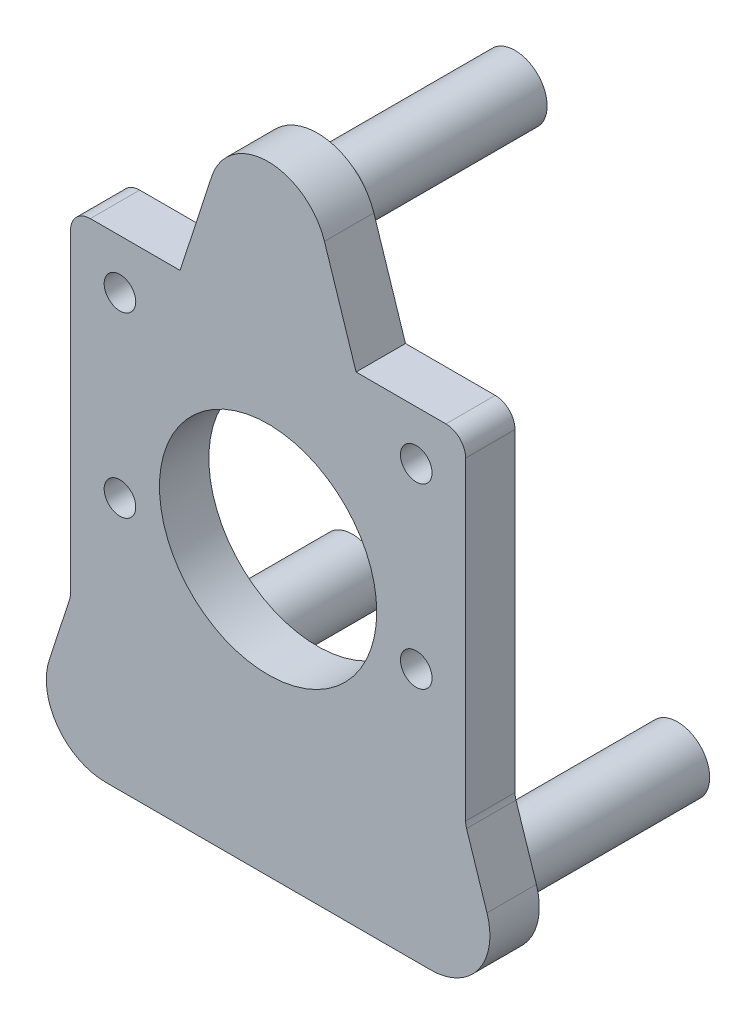
ISO-10303-21;
HEADER;
FILE_DESCRIPTION(('STEP AP214'),'2;1');
FILE_NAME('part.step','',(''),(''),'','','');
FILE_SCHEMA(('AUTOMOTIVE_DESIGN { 1 0 10303 214 1 1 1 1 }'));
ENDSEC;
DATA;
#1=APPLICATION_CONTEXT('core data for automotive mechanical design processes');
#2=APPLICATION_PROTOCOL_DEFINITION('international standard','automotive_design',2000,#1);
#3=PRODUCT_CONTEXT('',#1,'mechanical');
#4=PRODUCT('Part','Part','',(#3));
#5=PRODUCT_RELATED_PRODUCT_CATEGORY('part','',(#4));
#6=PRODUCT_DEFINITION_FORMATION('','',#4);
#7=PRODUCT_DEFINITION_CONTEXT('part definition',#1,'design');
#8=PRODUCT_DEFINITION('design','',#6,#7);
#9=PRODUCT_DEFINITION_SHAPE('','',#8);
#10=(LENGTH_UNIT() NAMED_UNIT(*) SI_UNIT(.MILLI.,.METRE.));
#11=(NAMED_UNIT(*) PLANE_ANGLE_UNIT() SI_UNIT($,.RADIAN.));
#12=(NAMED_UNIT(*) SI_UNIT($,.STERADIAN.) SOLID_ANGLE_UNIT());
#13=UNCERTAINTY_MEASURE_WITH_UNIT(LENGTH_MEASURE(1.E-05),#10,'distance_accuracy_value','');
#14=(GEOMETRIC_REPRESENTATION_CONTEXT(3) GLOBAL_UNCERTAINTY_ASSIGNED_CONTEXT((#13)) GLOBAL_UNIT_ASSIGNED_CONTEXT((#10,
#11,#12)) REPRESENTATION_CONTEXT('',''));
#15=CARTESIAN_POINT('',(0.,0.,0.));
#16=DIRECTION('',(0.,0.,1.));
#17=DIRECTION('',(1.,0.,0.));
#18=AXIS2_PLACEMENT_3D('',#15,#16,#17);
#19=CARTESIAN_POINT('',(5.70633909777092,29.8541019662497,5.));
#20=DIRECTION('',(-0.951056516295154,-0.309016994374947,0.));
#21=DIRECTION('',(0.309016994374947,-0.951056516295154,0.));
#22=AXIS2_PLACEMENT_3D('',#19,#20,#21);
#23=PLANE('',#22);
#24=DIRECTION('',(-0.309016994374947,0.951056516295154,0.));
#25=VECTOR('',#24,1.);
#26=CARTESIAN_POINT('',(5.70633909777092,29.8541019662497,5.));
#27=LINE('',#26,#25);
#28=CARTESIAN_POINT('',(8.90813091529285,20.,5.));
#29=VERTEX_POINT('',#28);
#30=CARTESIAN_POINT('',(5.70633909777093,29.8541019662497,5.));
#31=VERTEX_POINT('',#30);
#32=EDGE_CURVE('E168',#29,#31,#27,.T.);
#33=ORIENTED_EDGE('',*,*,#32,.F.);
#34=DIRECTION('',(0.,0.,1.));
#35=VECTOR('',#34,1.);
#36=CARTESIAN_POINT('',(8.90813091529285,20.,0.));
#37=LINE('',#36,#35);
#38=CARTESIAN_POINT('',(8.90813091529285,20.,0.));
#39=VERTEX_POINT('',#38);
#40=EDGE_CURVE('E156',#39,#29,#37,.T.);
#41=ORIENTED_EDGE('',*,*,#40,.F.);
#42=DIRECTION('',(-0.309016994374947,0.951056516295154,0.));
#43=VECTOR('',#42,1.);
#44=CARTESIAN_POINT('',(5.70633909777092,29.8541019662497,0.));
#45=LINE('',#44,#43);
#46=CARTESIAN_POINT('',(5.70633909777093,29.8541019662497,0.));
#47=VERTEX_POINT('',#46);
#48=EDGE_CURVE('E166',#39,#47,#45,.T.);
#49=ORIENTED_EDGE('',*,*,#48,.T.);
#50=DIRECTION('',(0.,0.,-1.));
#51=VECTOR('',#50,1.);
#52=CARTESIAN_POINT('',(5.70633909777093,29.8541019662497,5.));
#53=LINE('',#52,#51);
#54=EDGE_CURVE('E220',#31,#47,#53,.T.);
#55=ORIENTED_EDGE('',*,*,#54,.F.);
#56=EDGE_LOOP('',(#33,#41,#49,#55));
#57=FACE_BOUND('',#56,.T.);
#58=ADVANCED_FACE('F39',(#57),#23,.F.);
#59=CARTESIAN_POINT('',(-5.70633909777092,29.8541019662497,5.));
#60=DIRECTION('',(0.951056516295154,-0.309016994374947,0.));
#61=DIRECTION('',(0.309016994374947,0.951056516295154,0.));
#62=AXIS2_PLACEMENT_3D('',#59,#60,#61);
#63=PLANE('',#62);
#64=DIRECTION('',(-0.309016994374947,-0.951056516295154,0.));
#65=VECTOR('',#64,1.);
#66=CARTESIAN_POINT('',(-5.70633909777092,29.8541019662497,5.));
#67=LINE('',#66,#65);
#68=CARTESIAN_POINT('',(-20.0978869674098,-14.4385279866074,5.));
#69=VERTEX_POINT('',#68);
#70=CARTESIAN_POINT('',(-22.1643261619602,-20.7983738762488,5.));
#71=VERTEX_POINT('',#70);
#72=EDGE_CURVE('E301',#69,#71,#67,.T.);
#73=ORIENTED_EDGE('',*,*,#72,.F.);
#74=DIRECTION('',(0.,0.,1.));
#75=VECTOR('',#74,1.);
#76=CARTESIAN_POINT('',(-20.0978869674098,-14.4385279866074,5.));
#77=LINE('',#76,#75);
#78=CARTESIAN_POINT('',(-20.0978869674098,-14.4385279866074,0.));
#79=VERTEX_POINT('',#78);
#80=EDGE_CURVE('E269',#69,#79,#77,.F.);
#81=ORIENTED_EDGE('',*,*,#80,.T.);
#82=DIRECTION('',(-0.309016994374947,-0.951056516295154,0.));
#83=VECTOR('',#82,1.);
#84=CARTESIAN_POINT('',(-5.70633909777092,29.8541019662497,0.));
#85=LINE('',#84,#83);
#86=CARTESIAN_POINT('',(-22.1643261619602,-20.7983738762488,0.));
#87=VERTEX_POINT('',#86);
#88=EDGE_CURVE('E191',#79,#87,#85,.T.);
#89=ORIENTED_EDGE('',*,*,#88,.T.);
#90=DIRECTION('',(0.,0.,-1.));
#91=VECTOR('',#90,1.);
#92=CARTESIAN_POINT('',(-22.1643261619602,-20.7983738762488,5.));
#93=LINE('',#92,#91);
#94=EDGE_CURVE('E212',#71,#87,#93,.T.);
#95=ORIENTED_EDGE('',*,*,#94,.F.);
#96=EDGE_LOOP('',(#73,#81,#89,#95));
#97=FACE_BOUND('',#96,.T.);
#98=ADVANCED_FACE('F308',(#97),#63,.F.);
#99=CARTESIAN_POINT('',(16.4579870641893,-22.6524758424985,5.));
#100=DIRECTION('',(0.,0.,1.));
#101=DIRECTION('',(1.,0.,0.));
#102=AXIS2_PLACEMENT_3D('',#99,#100,#101);
#103=PLANE('',#102);
#104=CARTESIAN_POINT('',(-14.9999999999998,-3.,5.));
#105=DIRECTION('',(0.,0.,1.));
#106=DIRECTION('',(1.,0.,0.));
#107=AXIS2_PLACEMENT_3D('',#104,#105,#106);
#108=CIRCLE('',#107,1.6);
#109=CARTESIAN_POINT('',(-13.3999999999998,-3.,5.));
#110=VERTEX_POINT('',#109);
#111=EDGE_CURVE('E415',#110,#110,#108,.T.);
#112=ORIENTED_EDGE('',*,*,#111,.F.);
#113=EDGE_LOOP('',(#112));
#114=FACE_BOUND('',#113,.T.);
#115=CARTESIAN_POINT('',(15.0000000000002,-3.,5.));
#116=DIRECTION('',(0.,0.,1.));
#117=DIRECTION('',(1.,0.,0.));
#118=AXIS2_PLACEMENT_3D('',#115,#116,#117);
#119=CIRCLE('',#118,1.6);
#120=CARTESIAN_POINT('',(16.6000000000002,-3.,5.));
#121=VERTEX_POINT('',#120);
#122=EDGE_CURVE('E423',#121,#121,#119,.T.);
#123=ORIENTED_EDGE('',*,*,#122,.F.);
#124=EDGE_LOOP('',(#123));
#125=FACE_BOUND('',#124,.T.);
#126=CARTESIAN_POINT('',(15.,15.,5.));
#127=DIRECTION('',(0.,0.,1.));
#128=DIRECTION('',(1.,0.,0.));
#129=AXIS2_PLACEMENT_3D('',#126,#127,#128);
#130=CIRCLE('',#129,1.6);
#131=CARTESIAN_POINT('',(16.6,15.,5.));
#132=VERTEX_POINT('',#131);
#133=EDGE_CURVE('E431',#132,#132,#130,.T.);
#134=ORIENTED_EDGE('',*,*,#133,.F.);
#135=EDGE_LOOP('',(#134));
#136=FACE_BOUND('',#135,.T.);
#137=CARTESIAN_POINT('',(-15.,15.,5.));
#138=DIRECTION('',(0.,0.,1.));
#139=DIRECTION('',(1.,0.,0.));
#140=AXIS2_PLACEMENT_3D('',#137,#138,#139);
#141=CIRCLE('',#140,1.6);
#142=CARTESIAN_POINT('',(-13.4,15.,5.));
#143=VERTEX_POINT('',#142);
#144=EDGE_CURVE('E407',#143,#143,#141,.T.);
#145=ORIENTED_EDGE('',*,*,#144,.F.);
#146=EDGE_LOOP('',(#145));
#147=FACE_BOUND('',#146,.T.);
#148=DIRECTION('',(0.,1.,0.));
#149=VECTOR('',#148,1.);
#150=CARTESIAN_POINT('',(20.,20.,5.));
#151=LINE('',#150,#149);
#152=CARTESIAN_POINT('',(20.,-13.8204939978573,5.));
#153=VERTEX_POINT('',#152);
#154=CARTESIAN_POINT('',(20.,18.,5.));
#155=VERTEX_POINT('',#154);
#156=EDGE_CURVE('E162',#153,#155,#151,.T.);
#157=ORIENTED_EDGE('',*,*,#156,.T.);
#158=CARTESIAN_POINT('',(18.,18.,5.));
#159=DIRECTION('',(0.,0.,1.));
#160=DIRECTION('',(1.,0.,0.));
#161=AXIS2_PLACEMENT_3D('',#158,#159,#160);
#162=CIRCLE('',#161,2.);
#163=CARTESIAN_POINT('',(18.,20.,5.));
#164=VERTEX_POINT('',#163);
#165=EDGE_CURVE('E275',#155,#164,#162,.T.);
#166=ORIENTED_EDGE('',*,*,#165,.T.);
#167=DIRECTION('',(-1.,0.,0.));
#168=VECTOR('',#167,1.);
#169=CARTESIAN_POINT('',(8.90813091529285,20.,5.));
#170=LINE('',#169,#168);
#171=EDGE_CURVE('E396',#164,#29,#170,.T.);
#172=ORIENTED_EDGE('',*,*,#171,.T.);
#173=ORIENTED_EDGE('',*,*,#32,.T.);
#174=CARTESIAN_POINT('',(0.,28.,5.));
#175=DIRECTION('',(0.,0.,1.));
#176=DIRECTION('',(1.,0.,0.));
#177=AXIS2_PLACEMENT_3D('',#174,#175,#176);
#178=CIRCLE('',#177,6.);
#179=CARTESIAN_POINT('',(-5.70633909777092,29.8541019662497,5.));
#180=VERTEX_POINT('',#179);
#181=EDGE_CURVE('E313',#31,#180,#178,.T.);
#182=ORIENTED_EDGE('',*,*,#181,.T.);
#183=CARTESIAN_POINT('',(-8.90813091529286,20.,5.));
#184=VERTEX_POINT('',#183);
#185=EDGE_CURVE('E312',#180,#184,#67,.T.);
#186=ORIENTED_EDGE('',*,*,#185,.T.);
#187=DIRECTION('',(-1.,0.,0.));
#188=VECTOR('',#187,1.);
#189=CARTESIAN_POINT('',(-20.,20.,5.));
#190=LINE('',#189,#188);
#191=CARTESIAN_POINT('',(-18.,20.,5.));
#192=VERTEX_POINT('',#191);
#193=EDGE_CURVE('E325',#184,#192,#190,.T.);
#194=ORIENTED_EDGE('',*,*,#193,.T.);
#195=CARTESIAN_POINT('',(-18.,18.,5.));
#196=DIRECTION('',(0.,0.,1.));
#197=DIRECTION('',(1.,0.,0.));
#198=AXIS2_PLACEMENT_3D('',#195,#196,#197);
#199=CIRCLE('',#198,2.);
#200=CARTESIAN_POINT('',(-20.,18.,5.));
#201=VERTEX_POINT('',#200);
#202=EDGE_CURVE('E272',#192,#201,#199,.T.);
#203=ORIENTED_EDGE('',*,*,#202,.T.);
#204=DIRECTION('',(0.,-1.,0.));
#205=VECTOR('',#204,1.);
#206=CARTESIAN_POINT('',(-20.,20.,5.));
#207=LINE('',#206,#205);
#208=CARTESIAN_POINT('',(-20.0000000000001,-13.8204939978575,5.));
#209=VERTEX_POINT('',#208);
#210=EDGE_CURVE('E170',#201,#209,#207,.T.);
#211=ORIENTED_EDGE('',*,*,#210,.T.);
#212=CARTESIAN_POINT('',(-22.0000000000001,-13.8204939978575,5.));
#213=DIRECTION('',(0.,0.,1.));
#214=DIRECTION('',(1.,0.,0.));
#215=AXIS2_PLACEMENT_3D('',#212,#213,#214);
#216=CIRCLE('',#215,2.);
#217=EDGE_CURVE('E48',#209,#69,#216,.F.);
#218=ORIENTED_EDGE('',*,*,#217,.T.);
#219=ORIENTED_EDGE('',*,*,#72,.T.);
#220=CARTESIAN_POINT('',(-16.4579870641892,-22.6524758424985,5.));
#221=DIRECTION('',(0.,0.,1.));
#222=DIRECTION('',(1.,0.,0.));
#223=AXIS2_PLACEMENT_3D('',#220,#221,#222);
#224=CIRCLE('',#223,6.);
#225=CARTESIAN_POINT('',(-16.4579870641892,-28.6524758424985,5.));
#226=VERTEX_POINT('',#225);
#227=EDGE_CURVE('E370',#71,#226,#224,.T.);
#228=ORIENTED_EDGE('',*,*,#227,.T.);
#229=DIRECTION('',(1.,0.,0.));
#230=VECTOR('',#229,1.);
#231=CARTESIAN_POINT('',(-16.4579870641892,-28.6524758424985,5.));
#232=LINE('',#231,#230);
#233=CARTESIAN_POINT('',(16.4579870641893,-28.6524758424985,5.));
#234=VERTEX_POINT('',#233);
#235=EDGE_CURVE('E208',#226,#234,#232,.T.);
#236=ORIENTED_EDGE('',*,*,#235,.T.);
#237=CARTESIAN_POINT('',(16.4579870641893,-22.6524758424985,5.));
#238=DIRECTION('',(0.,0.,1.));
#239=DIRECTION('',(1.,0.,0.));
#240=AXIS2_PLACEMENT_3D('',#237,#238,#239);
#241=CIRCLE('',#240,6.);
#242=CARTESIAN_POINT('',(22.1643261619602,-20.7983738762488,5.));
#243=VERTEX_POINT('',#242);
#244=EDGE_CURVE('E202',#234,#243,#241,.T.);
#245=ORIENTED_EDGE('',*,*,#244,.T.);
#246=CARTESIAN_POINT('',(20.0978869674097,-14.4385279866072,5.));
#247=VERTEX_POINT('',#246);
#248=EDGE_CURVE('E362',#243,#247,#27,.T.);
#249=ORIENTED_EDGE('',*,*,#248,.T.);
#250=CARTESIAN_POINT('',(22.,-13.8204939978573,5.));
#251=DIRECTION('',(0.,0.,1.));
#252=DIRECTION('',(1.,0.,0.));
#253=AXIS2_PLACEMENT_3D('',#250,#251,#252);
#254=CIRCLE('',#253,2.);
#255=EDGE_CURVE('E289',#247,#153,#254,.F.);
#256=ORIENTED_EDGE('',*,*,#255,.T.);
#257=EDGE_LOOP('',(#157,#166,#172,#173,#182,#186,#194,#203,#211,#218,#219,#228,#236,#245,#249,#256));
#258=FACE_BOUND('',#257,.T.);
#259=CARTESIAN_POINT('',(0.,0.,5.));
#260=DIRECTION('',(0.,0.,1.));
#261=DIRECTION('',(1.,0.,0.));
#262=AXIS2_PLACEMENT_3D('',#259,#260,#261);
#263=CIRCLE('',#262,11.);
#264=CARTESIAN_POINT('',(11.,0.,5.));
#265=VERTEX_POINT('',#264);
#266=EDGE_CURVE('E185',#265,#265,#263,.T.);
#267=ORIENTED_EDGE('',*,*,#266,.F.);
#268=EDGE_LOOP('',(#267));
#269=FACE_BOUND('',#268,.T.);
#270=ADVANCED_FACE('F299',(#114,#125,#136,#147,#258,#269),#103,.T.);
#271=CARTESIAN_POINT('',(16.4579870641893,-22.6524758424985,0.));
#272=DIRECTION('',(0.,0.,1.));
#273=DIRECTION('',(1.,0.,0.));
#274=AXIS2_PLACEMENT_3D('',#271,#272,#273);
#275=PLANE('',#274);
#276=CARTESIAN_POINT('',(-14.9999999999998,-3.,0.));
#277=DIRECTION('',(0.,0.,1.));
#278=DIRECTION('',(1.,0.,0.));
#279=AXIS2_PLACEMENT_3D('',#276,#277,#278);
#280=CIRCLE('',#279,1.6);
#281=CARTESIAN_POINT('',(-13.3999999999998,-3.,0.));
#282=VERTEX_POINT('',#281);
#283=EDGE_CURVE('E419',#282,#282,#280,.T.);
#284=ORIENTED_EDGE('',*,*,#283,.T.);
#285=EDGE_LOOP('',(#284));
#286=FACE_BOUND('',#285,.T.);
#287=CARTESIAN_POINT('',(15.0000000000002,-3.,0.));
#288=DIRECTION('',(0.,0.,1.));
#289=DIRECTION('',(1.,0.,0.));
#290=AXIS2_PLACEMENT_3D('',#287,#288,#289);
#291=CIRCLE('',#290,1.6);
#292=CARTESIAN_POINT('',(16.6000000000002,-3.,0.));
#293=VERTEX_POINT('',#292);
#294=EDGE_CURVE('E427',#293,#293,#291,.T.);
#295=ORIENTED_EDGE('',*,*,#294,.T.);
#296=EDGE_LOOP('',(#295));
#297=FACE_BOUND('',#296,.T.);
#298=CARTESIAN_POINT('',(15.,15.,0.));
#299=DIRECTION('',(0.,0.,1.));
#300=DIRECTION('',(1.,0.,0.));
#301=AXIS2_PLACEMENT_3D('',#298,#299,#300);
#302=CIRCLE('',#301,1.6);
#303=CARTESIAN_POINT('',(16.6,15.,0.));
#304=VERTEX_POINT('',#303);
#305=EDGE_CURVE('E413',#304,#304,#302,.T.);
#306=ORIENTED_EDGE('',*,*,#305,.T.);
#307=EDGE_LOOP('',(#306));
#308=FACE_BOUND('',#307,.T.);
#309=CARTESIAN_POINT('',(-15.,15.,0.));
#310=DIRECTION('',(0.,0.,1.));
#311=DIRECTION('',(1.,0.,0.));
#312=AXIS2_PLACEMENT_3D('',#309,#310,#311);
#313=CIRCLE('',#312,1.6);
#314=CARTESIAN_POINT('',(-13.4,15.,0.));
#315=VERTEX_POINT('',#314);
#316=EDGE_CURVE('E404',#315,#315,#313,.T.);
#317=ORIENTED_EDGE('',*,*,#316,.T.);
#318=EDGE_LOOP('',(#317));
#319=FACE_BOUND('',#318,.T.);
#320=CARTESIAN_POINT('',(-16.4579870641892,-22.6524758424985,0.));
#321=DIRECTION('',(0.,0.,1.));
#322=DIRECTION('',(1.,0.,0.));
#323=AXIS2_PLACEMENT_3D('',#320,#321,#322);
#324=CIRCLE('',#323,5.25);
#325=CARTESIAN_POINT('',(-11.2079870641892,-22.6524758424985,0.));
#326=VERTEX_POINT('',#325);
#327=EDGE_CURVE('E239',#326,#326,#324,.T.);
#328=ORIENTED_EDGE('',*,*,#327,.T.);
#329=EDGE_LOOP('',(#328));
#330=FACE_BOUND('',#329,.T.);
#331=CARTESIAN_POINT('',(16.4579870641893,-22.6524758424985,0.));
#332=DIRECTION('',(0.,0.,1.));
#333=DIRECTION('',(1.,0.,0.));
#334=AXIS2_PLACEMENT_3D('',#331,#332,#333);
#335=CIRCLE('',#334,5.25);
#336=CARTESIAN_POINT('',(21.7079870641893,-22.6524758424985,0.));
#337=VERTEX_POINT('',#336);
#338=EDGE_CURVE('E235',#337,#337,#335,.T.);
#339=ORIENTED_EDGE('',*,*,#338,.T.);
#340=EDGE_LOOP('',(#339));
#341=FACE_BOUND('',#340,.T.);
#342=CARTESIAN_POINT('',(0.,28.,0.));
#343=DIRECTION('',(0.,0.,1.));
#344=DIRECTION('',(1.,0.,0.));
#345=AXIS2_PLACEMENT_3D('',#342,#343,#344);
#346=CIRCLE('',#345,5.25);
#347=CARTESIAN_POINT('',(5.25,28.,0.));
#348=VERTEX_POINT('',#347);
#349=EDGE_CURVE('E231',#348,#348,#346,.T.);
#350=ORIENTED_EDGE('',*,*,#349,.T.);
#351=EDGE_LOOP('',(#350));
#352=FACE_BOUND('',#351,.T.);
#353=DIRECTION('',(-1.,0.,0.));
#354=VECTOR('',#353,1.);
#355=CARTESIAN_POINT('',(8.90813091529285,20.,0.));
#356=LINE('',#355,#354);
#357=CARTESIAN_POINT('',(18.,20.,0.));
#358=VERTEX_POINT('',#357);
#359=EDGE_CURVE('E153',#358,#39,#356,.T.);
#360=ORIENTED_EDGE('',*,*,#359,.F.);
#361=CARTESIAN_POINT('',(18.,18.,0.));
#362=DIRECTION('',(0.,0.,1.));
#363=DIRECTION('',(1.,0.,0.));
#364=AXIS2_PLACEMENT_3D('',#361,#362,#363);
#365=CIRCLE('',#364,2.);
#366=CARTESIAN_POINT('',(20.,18.,0.));
#367=VERTEX_POINT('',#366);
#368=EDGE_CURVE('E282',#358,#367,#365,.F.);
#369=ORIENTED_EDGE('',*,*,#368,.T.);
#370=DIRECTION('',(0.,1.,0.));
#371=VECTOR('',#370,1.);
#372=CARTESIAN_POINT('',(20.,20.,0.));
#373=LINE('',#372,#371);
#374=CARTESIAN_POINT('',(20.,-13.8204939978573,0.));
#375=VERTEX_POINT('',#374);
#376=EDGE_CURVE('E161',#375,#367,#373,.T.);
#377=ORIENTED_EDGE('',*,*,#376,.F.);
#378=CARTESIAN_POINT('',(22.,-13.8204939978573,0.));
#379=DIRECTION('',(0.,0.,1.));
#380=DIRECTION('',(1.,0.,0.));
#381=AXIS2_PLACEMENT_3D('',#378,#379,#380);
#382=CIRCLE('',#381,2.);
#383=CARTESIAN_POINT('',(20.0978869674097,-14.4385279866072,0.));
#384=VERTEX_POINT('',#383);
#385=EDGE_CURVE('E292',#375,#384,#382,.T.);
#386=ORIENTED_EDGE('',*,*,#385,.T.);
#387=CARTESIAN_POINT('',(22.1643261619602,-20.7983738762488,0.));
#388=VERTEX_POINT('',#387);
#389=EDGE_CURVE('E178',#388,#384,#45,.T.);
#390=ORIENTED_EDGE('',*,*,#389,.F.);
#391=CARTESIAN_POINT('',(16.4579870641893,-22.6524758424985,0.));
#392=DIRECTION('',(0.,0.,1.));
#393=DIRECTION('',(1.,0.,0.));
#394=AXIS2_PLACEMENT_3D('',#391,#392,#393);
#395=CIRCLE('',#394,6.);
#396=CARTESIAN_POINT('',(16.4579870641893,-28.6524758424985,0.));
#397=VERTEX_POINT('',#396);
#398=EDGE_CURVE('E179',#397,#388,#395,.T.);
#399=ORIENTED_EDGE('',*,*,#398,.F.);
#400=DIRECTION('',(1.,0.,0.));
#401=VECTOR('',#400,1.);
#402=CARTESIAN_POINT('',(-16.4579870641892,-28.6524758424985,0.));
#403=LINE('',#402,#401);
#404=CARTESIAN_POINT('',(-16.4579870641892,-28.6524758424985,0.));
#405=VERTEX_POINT('',#404);
#406=EDGE_CURVE('E199',#405,#397,#403,.T.);
#407=ORIENTED_EDGE('',*,*,#406,.F.);
#408=CARTESIAN_POINT('',(-16.4579870641892,-22.6524758424985,0.));
#409=DIRECTION('',(0.,0.,1.));
#410=DIRECTION('',(1.,0.,0.));
#411=AXIS2_PLACEMENT_3D('',#408,#409,#410);
#412=CIRCLE('',#411,6.);
#413=EDGE_CURVE('E196',#87,#405,#412,.T.);
#414=ORIENTED_EDGE('',*,*,#413,.F.);
#415=ORIENTED_EDGE('',*,*,#88,.F.);
#416=CARTESIAN_POINT('',(-22.0000000000001,-13.8204939978575,0.));
#417=DIRECTION('',(0.,0.,1.));
#418=DIRECTION('',(1.,0.,0.));
#419=AXIS2_PLACEMENT_3D('',#416,#417,#418);
#420=CIRCLE('',#419,2.);
#421=CARTESIAN_POINT('',(-20.0000000000001,-13.8204939978575,0.));
#422=VERTEX_POINT('',#421);
#423=EDGE_CURVE('E11',#79,#422,#420,.T.);
#424=ORIENTED_EDGE('',*,*,#423,.T.);
#425=DIRECTION('',(0.,-1.,0.));
#426=VECTOR('',#425,1.);
#427=CARTESIAN_POINT('',(-20.,20.,0.));
#428=LINE('',#427,#426);
#429=CARTESIAN_POINT('',(-20.,18.,0.));
#430=VERTEX_POINT('',#429);
#431=EDGE_CURVE('E318',#430,#422,#428,.T.);
#432=ORIENTED_EDGE('',*,*,#431,.F.);
#433=CARTESIAN_POINT('',(-18.,18.,0.));
#434=DIRECTION('',(0.,0.,1.));
#435=DIRECTION('',(1.,0.,0.));
#436=AXIS2_PLACEMENT_3D('',#433,#434,#435);
#437=CIRCLE('',#436,2.);
#438=CARTESIAN_POINT('',(-18.,20.,0.));
#439=VERTEX_POINT('',#438);
#440=EDGE_CURVE('E55',#430,#439,#437,.F.);
#441=ORIENTED_EDGE('',*,*,#440,.T.);
#442=DIRECTION('',(-1.,0.,0.));
#443=VECTOR('',#442,1.);
#444=CARTESIAN_POINT('',(-20.,20.,0.));
#445=LINE('',#444,#443);
#446=CARTESIAN_POINT('',(-8.90813091529286,20.,0.));
#447=VERTEX_POINT('',#446);
#448=EDGE_CURVE('E324',#447,#439,#445,.T.);
#449=ORIENTED_EDGE('',*,*,#448,.F.);
#450=CARTESIAN_POINT('',(-5.70633909777092,29.8541019662497,0.));
#451=VERTEX_POINT('',#450);
#452=EDGE_CURVE('E192',#451,#447,#85,.T.);
#453=ORIENTED_EDGE('',*,*,#452,.F.);
#454=CARTESIAN_POINT('',(0.,28.,0.));
#455=DIRECTION('',(0.,0.,1.));
#456=DIRECTION('',(1.,0.,0.));
#457=AXIS2_PLACEMENT_3D('',#454,#455,#456);
#458=CIRCLE('',#457,6.);
#459=EDGE_CURVE('E176',#47,#451,#458,.T.);
#460=ORIENTED_EDGE('',*,*,#459,.F.);
#461=ORIENTED_EDGE('',*,*,#48,.F.);
#462=EDGE_LOOP('',(#360,#369,#377,#386,#390,#399,#407,#414,#415,#424,#432,#441,#449,#453,#460,#461));
#463=FACE_BOUND('',#462,.T.);
#464=CARTESIAN_POINT('',(0.,0.,0.));
#465=DIRECTION('',(0.,0.,1.));
#466=DIRECTION('',(1.,0.,0.));
#467=AXIS2_PLACEMENT_3D('',#464,#465,#466);
#468=CIRCLE('',#467,11.);
#469=CARTESIAN_POINT('',(11.,0.,0.));
#470=VERTEX_POINT('',#469);
#471=EDGE_CURVE('E352',#470,#470,#468,.T.);
#472=ORIENTED_EDGE('',*,*,#471,.T.);
#473=EDGE_LOOP('',(#472));
#474=FACE_BOUND('',#473,.T.);
#475=ADVANCED_FACE('F173',(#286,#297,#308,#319,#330,#341,#352,#463,#474),#275,.F.);
#476=CARTESIAN_POINT('',(16.4579870641893,-22.6524758424985,5.));
#477=DIRECTION('',(0.,0.,-1.));
#478=DIRECTION('',(-1.,0.,0.));
#479=AXIS2_PLACEMENT_3D('',#476,#477,#478);
#480=CYLINDRICAL_SURFACE('',#479,6.);
#481=ORIENTED_EDGE('',*,*,#398,.T.);
#482=DIRECTION('',(0.,0.,-1.));
#483=VECTOR('',#482,1.);
#484=CARTESIAN_POINT('',(22.1643261619602,-20.7983738762488,5.));
#485=LINE('',#484,#483);
#486=EDGE_CURVE('E223',#243,#388,#485,.T.);
#487=ORIENTED_EDGE('',*,*,#486,.F.);
#488=ORIENTED_EDGE('',*,*,#244,.F.);
#489=DIRECTION('',(0.,0.,-1.));
#490=VECTOR('',#489,1.);
#491=CARTESIAN_POINT('',(16.4579870641893,-28.6524758424985,5.));
#492=LINE('',#491,#490);
#493=EDGE_CURVE('E203',#234,#397,#492,.T.);
#494=ORIENTED_EDGE('',*,*,#493,.T.);
#495=EDGE_LOOP('',(#481,#487,#488,#494));
#496=FACE_BOUND('',#495,.T.);
#497=ADVANCED_FACE('F383',(#496),#480,.T.);
#498=ORIENTED_EDGE('',*,*,#389,.T.);
#499=DIRECTION('',(0.,0.,1.));
#500=VECTOR('',#499,1.);
#501=CARTESIAN_POINT('',(20.0978869674097,-14.4385279866072,5.));
#502=LINE('',#501,#500);
#503=EDGE_CURVE('E251',#384,#247,#502,.T.);
#504=ORIENTED_EDGE('',*,*,#503,.T.);
#505=ORIENTED_EDGE('',*,*,#248,.F.);
#506=ORIENTED_EDGE('',*,*,#486,.T.);
#507=EDGE_LOOP('',(#498,#504,#505,#506));
#508=FACE_BOUND('',#507,.T.);
#509=ADVANCED_FACE('F385',(#508),#23,.F.);
#510=CARTESIAN_POINT('',(0.,28.,5.));
#511=DIRECTION('',(0.,0.,-1.));
#512=DIRECTION('',(-1.,0.,0.));
#513=AXIS2_PLACEMENT_3D('',#510,#511,#512);
#514=CYLINDRICAL_SURFACE('',#513,6.);
#515=ORIENTED_EDGE('',*,*,#459,.T.);
#516=DIRECTION('',(0.,0.,-1.));
#517=VECTOR('',#516,1.);
#518=CARTESIAN_POINT('',(-5.70633909777092,29.8541019662497,5.));
#519=LINE('',#518,#517);
#520=EDGE_CURVE('E216',#180,#451,#519,.T.);
#521=ORIENTED_EDGE('',*,*,#520,.F.);
#522=ORIENTED_EDGE('',*,*,#181,.F.);
#523=ORIENTED_EDGE('',*,*,#54,.T.);
#524=EDGE_LOOP('',(#515,#521,#522,#523));
#525=FACE_BOUND('',#524,.T.);
#526=ADVANCED_FACE('F476',(#525),#514,.T.);
#527=ORIENTED_EDGE('',*,*,#452,.T.);
#528=DIRECTION('',(0.,0.,1.));
#529=VECTOR('',#528,1.);
#530=CARTESIAN_POINT('',(-8.90813091529286,20.,0.));
#531=LINE('',#530,#529);
#532=EDGE_CURVE('E329',#447,#184,#531,.T.);
#533=ORIENTED_EDGE('',*,*,#532,.T.);
#534=ORIENTED_EDGE('',*,*,#185,.F.);
#535=ORIENTED_EDGE('',*,*,#520,.T.);
#536=EDGE_LOOP('',(#527,#533,#534,#535));
#537=FACE_BOUND('',#536,.T.);
#538=ADVANCED_FACE('F472',(#537),#63,.F.);
#539=CARTESIAN_POINT('',(-16.4579870641892,-22.6524758424985,5.));
#540=DIRECTION('',(0.,0.,-1.));
#541=DIRECTION('',(-1.,0.,0.));
#542=AXIS2_PLACEMENT_3D('',#539,#540,#541);
#543=CYLINDRICAL_SURFACE('',#542,6.);
#544=ORIENTED_EDGE('',*,*,#413,.T.);
#545=DIRECTION('',(0.,0.,-1.));
#546=VECTOR('',#545,1.);
#547=CARTESIAN_POINT('',(-16.4579870641892,-28.6524758424985,5.));
#548=LINE('',#547,#546);
#549=EDGE_CURVE('E207',#226,#405,#548,.T.);
#550=ORIENTED_EDGE('',*,*,#549,.F.);
#551=ORIENTED_EDGE('',*,*,#227,.F.);
#552=ORIENTED_EDGE('',*,*,#94,.T.);
#553=EDGE_LOOP('',(#544,#550,#551,#552));
#554=FACE_BOUND('',#553,.T.);
#555=ADVANCED_FACE('F680',(#554),#543,.T.);
#556=CARTESIAN_POINT('',(-16.4579870641892,-28.6524758424985,5.));
#557=DIRECTION('',(0.,1.,0.));
#558=DIRECTION('',(-1.,0.,0.));
#559=AXIS2_PLACEMENT_3D('',#556,#557,#558);
#560=PLANE('',#559);
#561=ORIENTED_EDGE('',*,*,#406,.T.);
#562=ORIENTED_EDGE('',*,*,#493,.F.);
#563=ORIENTED_EDGE('',*,*,#235,.F.);
#564=ORIENTED_EDGE('',*,*,#549,.T.);
#565=EDGE_LOOP('',(#561,#562,#563,#564));
#566=FACE_BOUND('',#565,.T.);
#567=ADVANCED_FACE('F379',(#566),#560,.F.);
#568=CARTESIAN_POINT('',(0.,0.,5.));
#569=DIRECTION('',(0.,0.,-1.));
#570=DIRECTION('',(-1.,0.,0.));
#571=AXIS2_PLACEMENT_3D('',#568,#569,#570);
#572=CYLINDRICAL_SURFACE('',#571,11.);
#573=ORIENTED_EDGE('',*,*,#266,.T.);
#574=EDGE_LOOP('',(#573));
#575=FACE_BOUND('',#574,.T.);
#576=ORIENTED_EDGE('',*,*,#471,.F.);
#577=EDGE_LOOP('',(#576));
#578=FACE_BOUND('',#577,.T.);
#579=ADVANCED_FACE('F577',(#575,#578),#572,.F.);
#580=CARTESIAN_POINT('',(0.,28.,-20.));
#581=DIRECTION('',(0.,0.,1.));
#582=DIRECTION('',(1.,0.,0.));
#583=AXIS2_PLACEMENT_3D('',#580,#581,#582);
#584=CYLINDRICAL_SURFACE('',#583,3.25);
#585=CARTESIAN_POINT('',(0.,28.,-2.));
#586=DIRECTION('',(0.,0.,1.));
#587=DIRECTION('',(1.,0.,0.));
#588=AXIS2_PLACEMENT_3D('',#585,#586,#587);
#589=CIRCLE('',#588,3.25);
#590=CARTESIAN_POINT('',(3.25,28.,-2.));
#591=VERTEX_POINT('',#590);
#592=EDGE_CURVE('E247',#591,#591,#589,.F.);
#593=ORIENTED_EDGE('',*,*,#592,.T.);
#594=EDGE_LOOP('',(#593));
#595=FACE_BOUND('',#594,.T.);
#596=CARTESIAN_POINT('',(0.,28.,-20.));
#597=DIRECTION('',(0.,0.,-1.));
#598=DIRECTION('',(-1.,0.,0.));
#599=AXIS2_PLACEMENT_3D('',#596,#597,#598);
#600=CIRCLE('',#599,3.25);
#601=CARTESIAN_POINT('',(-3.25,28.,-20.));
#602=VERTEX_POINT('',#601);
#603=EDGE_CURVE('E348',#602,#602,#600,.T.);
#604=ORIENTED_EDGE('',*,*,#603,.F.);
#605=EDGE_LOOP('',(#604));
#606=FACE_BOUND('',#605,.T.);
#607=ADVANCED_FACE('F572',(#595,#606),#584,.T.);
#608=CARTESIAN_POINT('',(0.,28.,-20.));
#609=DIRECTION('',(0.,0.,-1.));
#610=DIRECTION('',(-1.,0.,0.));
#611=AXIS2_PLACEMENT_3D('',#608,#609,#610);
#612=PLANE('',#611);
#613=ORIENTED_EDGE('',*,*,#603,.T.);
#614=EDGE_LOOP('',(#613));
#615=FACE_BOUND('',#614,.T.);
#616=ADVANCED_FACE('F576',(#615),#612,.T.);
#617=CARTESIAN_POINT('',(16.4579870641893,-22.6524758424985,-20.));
#618=DIRECTION('',(0.,0.,1.));
#619=DIRECTION('',(1.,0.,0.));
#620=AXIS2_PLACEMENT_3D('',#617,#618,#619);
#621=CYLINDRICAL_SURFACE('',#620,3.25);
#622=CARTESIAN_POINT('',(16.4579870641893,-22.6524758424985,-2.));
#623=DIRECTION('',(0.,0.,1.));
#624=DIRECTION('',(1.,0.,0.));
#625=AXIS2_PLACEMENT_3D('',#622,#623,#624);
#626=CIRCLE('',#625,3.25);
#627=CARTESIAN_POINT('',(19.7079870641893,-22.6524758424985,-2.));
#628=VERTEX_POINT('',#627);
#629=EDGE_CURVE('E243',#628,#628,#626,.F.);
#630=ORIENTED_EDGE('',*,*,#629,.T.);
#631=EDGE_LOOP('',(#630));
#632=FACE_BOUND('',#631,.T.);
#633=CARTESIAN_POINT('',(16.4579870641893,-22.6524758424985,-20.));
#634=DIRECTION('',(0.,0.,-1.));
#635=DIRECTION('',(-1.,0.,0.));
#636=AXIS2_PLACEMENT_3D('',#633,#634,#635);
#637=CIRCLE('',#636,3.25);
#638=CARTESIAN_POINT('',(13.2079870641893,-22.6524758424985,-20.));
#639=VERTEX_POINT('',#638);
#640=EDGE_CURVE('E344',#639,#639,#637,.T.);
#641=ORIENTED_EDGE('',*,*,#640,.F.);
#642=EDGE_LOOP('',(#641));
#643=FACE_BOUND('',#642,.T.);
#644=ADVANCED_FACE('F587',(#632,#643),#621,.T.);
#645=CARTESIAN_POINT('',(16.4579870641893,-22.6524758424985,-20.));
#646=DIRECTION('',(0.,0.,-1.));
#647=DIRECTION('',(-1.,0.,0.));
#648=AXIS2_PLACEMENT_3D('',#645,#646,#647);
#649=PLANE('',#648);
#650=ORIENTED_EDGE('',*,*,#640,.T.);
#651=EDGE_LOOP('',(#650));
#652=FACE_BOUND('',#651,.T.);
#653=ADVANCED_FACE('F596',(#652),#649,.T.);
#654=CARTESIAN_POINT('',(-16.4579870641892,-22.6524758424985,-20.));
#655=DIRECTION('',(0.,0.,1.));
#656=DIRECTION('',(1.,0.,0.));
#657=AXIS2_PLACEMENT_3D('',#654,#655,#656);
#658=CYLINDRICAL_SURFACE('',#657,3.25);
#659=CARTESIAN_POINT('',(-16.4579870641892,-22.6524758424985,-2.));
#660=DIRECTION('',(0.,0.,1.));
#661=DIRECTION('',(1.,0.,0.));
#662=AXIS2_PLACEMENT_3D('',#659,#660,#661);
#663=CIRCLE('',#662,3.25);
#664=CARTESIAN_POINT('',(-13.2079870641892,-22.6524758424985,-2.));
#665=VERTEX_POINT('',#664);
#666=EDGE_CURVE('E227',#665,#665,#663,.F.);
#667=ORIENTED_EDGE('',*,*,#666,.T.);
#668=EDGE_LOOP('',(#667));
#669=FACE_BOUND('',#668,.T.);
#670=CARTESIAN_POINT('',(-16.4579870641892,-22.6524758424985,-20.));
#671=DIRECTION('',(0.,0.,-1.));
#672=DIRECTION('',(-1.,0.,0.));
#673=AXIS2_PLACEMENT_3D('',#670,#671,#672);
#674=CIRCLE('',#673,3.25);
#675=CARTESIAN_POINT('',(-19.7079870641892,-22.6524758424985,-20.));
#676=VERTEX_POINT('',#675);
#677=EDGE_CURVE('E340',#676,#676,#674,.T.);
#678=ORIENTED_EDGE('',*,*,#677,.F.);
#679=EDGE_LOOP('',(#678));
#680=FACE_BOUND('',#679,.T.);
#681=ADVANCED_FACE('F604',(#669,#680),#658,.T.);
#682=CARTESIAN_POINT('',(-16.4579870641892,-22.6524758424985,-20.));
#683=DIRECTION('',(0.,0.,-1.));
#684=DIRECTION('',(-1.,0.,0.));
#685=AXIS2_PLACEMENT_3D('',#682,#683,#684);
#686=PLANE('',#685);
#687=ORIENTED_EDGE('',*,*,#677,.T.);
#688=EDGE_LOOP('',(#687));
#689=FACE_BOUND('',#688,.T.);
#690=ADVANCED_FACE('F493',(#689),#686,.T.);
#691=CARTESIAN_POINT('',(-16.4579870641892,-22.6524758424985,-2.));
#692=DIRECTION('',(0.,0.,1.));
#693=DIRECTION('',(1.,0.,0.));
#694=AXIS2_PLACEMENT_3D('',#691,#692,#693);
#695=TOROIDAL_SURFACE('',#694,5.25,2.);
#696=ORIENTED_EDGE('',*,*,#327,.F.);
#697=EDGE_LOOP('',(#696));
#698=FACE_BOUND('',#697,.T.);
#699=ORIENTED_EDGE('',*,*,#666,.F.);
#700=EDGE_LOOP('',(#699));
#701=FACE_BOUND('',#700,.T.);
#702=ADVANCED_FACE('F489',(#698,#701),#695,.F.);
#703=CARTESIAN_POINT('',(16.4579870641893,-22.6524758424985,-2.));
#704=DIRECTION('',(0.,0.,1.));
#705=DIRECTION('',(1.,0.,0.));
#706=AXIS2_PLACEMENT_3D('',#703,#704,#705);
#707=TOROIDAL_SURFACE('',#706,5.25,2.);
#708=ORIENTED_EDGE('',*,*,#338,.F.);
#709=EDGE_LOOP('',(#708));
#710=FACE_BOUND('',#709,.T.);
#711=ORIENTED_EDGE('',*,*,#629,.F.);
#712=EDGE_LOOP('',(#711));
#713=FACE_BOUND('',#712,.T.);
#714=ADVANCED_FACE('F492',(#710,#713),#707,.F.);
#715=CARTESIAN_POINT('',(0.,28.,-2.));
#716=DIRECTION('',(0.,0.,1.));
#717=DIRECTION('',(1.,0.,0.));
#718=AXIS2_PLACEMENT_3D('',#715,#716,#717);
#719=TOROIDAL_SURFACE('',#718,5.25,2.);
#720=ORIENTED_EDGE('',*,*,#349,.F.);
#721=EDGE_LOOP('',(#720));
#722=FACE_BOUND('',#721,.T.);
#723=ORIENTED_EDGE('',*,*,#592,.F.);
#724=EDGE_LOOP('',(#723));
#725=FACE_BOUND('',#724,.T.);
#726=ADVANCED_FACE('F497',(#722,#725),#719,.F.);
#727=CARTESIAN_POINT('',(-20.,20.,0.));
#728=DIRECTION('',(-1.,0.,0.));
#729=DIRECTION('',(0.,-1.,0.));
#730=AXIS2_PLACEMENT_3D('',#727,#728,#729);
#731=PLANE('',#730);
#732=ORIENTED_EDGE('',*,*,#431,.T.);
#733=DIRECTION('',(0.,0.,1.));
#734=VECTOR('',#733,1.);
#735=CARTESIAN_POINT('',(-20.0000000000001,-13.8204939978575,0.));
#736=LINE('',#735,#734);
#737=EDGE_CURVE('E265',#422,#209,#736,.T.);
#738=ORIENTED_EDGE('',*,*,#737,.T.);
#739=ORIENTED_EDGE('',*,*,#210,.F.);
#740=DIRECTION('',(0.,0.,1.));
#741=VECTOR('',#740,1.);
#742=CARTESIAN_POINT('',(-20.,18.,0.));
#743=LINE('',#742,#741);
#744=EDGE_CURVE('E262',#201,#430,#743,.F.);
#745=ORIENTED_EDGE('',*,*,#744,.T.);
#746=EDGE_LOOP('',(#732,#738,#739,#745));
#747=FACE_BOUND('',#746,.T.);
#748=ADVANCED_FACE('F321',(#747),#731,.T.);
#749=CARTESIAN_POINT('',(-20.,20.,0.));
#750=DIRECTION('',(0.,1.,0.));
#751=DIRECTION('',(-1.,0.,0.));
#752=AXIS2_PLACEMENT_3D('',#749,#750,#751);
#753=PLANE('',#752);
#754=ORIENTED_EDGE('',*,*,#448,.T.);
#755=DIRECTION('',(0.,0.,1.));
#756=VECTOR('',#755,1.);
#757=CARTESIAN_POINT('',(-18.,20.,0.));
#758=LINE('',#757,#756);
#759=EDGE_CURVE('E285',#439,#192,#758,.T.);
#760=ORIENTED_EDGE('',*,*,#759,.T.);
#761=ORIENTED_EDGE('',*,*,#193,.F.);
#762=ORIENTED_EDGE('',*,*,#532,.F.);
#763=EDGE_LOOP('',(#754,#760,#761,#762));
#764=FACE_BOUND('',#763,.T.);
#765=ADVANCED_FACE('F634',(#764),#753,.T.);
#766=CARTESIAN_POINT('',(8.90813091529285,20.,0.));
#767=DIRECTION('',(0.,1.,0.));
#768=DIRECTION('',(-1.,0.,0.));
#769=AXIS2_PLACEMENT_3D('',#766,#767,#768);
#770=PLANE('',#769);
#771=ORIENTED_EDGE('',*,*,#171,.F.);
#772=DIRECTION('',(0.,0.,1.));
#773=VECTOR('',#772,1.);
#774=CARTESIAN_POINT('',(18.,20.,0.));
#775=LINE('',#774,#773);
#776=EDGE_CURVE('E63',#164,#358,#775,.F.);
#777=ORIENTED_EDGE('',*,*,#776,.T.);
#778=ORIENTED_EDGE('',*,*,#359,.T.);
#779=ORIENTED_EDGE('',*,*,#40,.T.);
#780=EDGE_LOOP('',(#771,#777,#778,#779));
#781=FACE_BOUND('',#780,.T.);
#782=ADVANCED_FACE('F155',(#781),#770,.T.);
#783=CARTESIAN_POINT('',(20.,20.,0.));
#784=DIRECTION('',(1.,0.,0.));
#785=DIRECTION('',(0.,0.,-1.));
#786=AXIS2_PLACEMENT_3D('',#783,#784,#785);
#787=PLANE('',#786);
#788=ORIENTED_EDGE('',*,*,#156,.F.);
#789=DIRECTION('',(0.,0.,1.));
#790=VECTOR('',#789,1.);
#791=CARTESIAN_POINT('',(20.,-13.8204939978573,0.));
#792=LINE('',#791,#790);
#793=EDGE_CURVE('E259',#153,#375,#792,.F.);
#794=ORIENTED_EDGE('',*,*,#793,.T.);
#795=ORIENTED_EDGE('',*,*,#376,.T.);
#796=DIRECTION('',(0.,0.,1.));
#797=VECTOR('',#796,1.);
#798=CARTESIAN_POINT('',(20.,18.,0.));
#799=LINE('',#798,#797);
#800=EDGE_CURVE('E255',#367,#155,#799,.T.);
#801=ORIENTED_EDGE('',*,*,#800,.T.);
#802=EDGE_LOOP('',(#788,#794,#795,#801));
#803=FACE_BOUND('',#802,.T.);
#804=ADVANCED_FACE('F391',(#803),#787,.T.);
#805=CARTESIAN_POINT('',(22.,-13.8204939978573,5.));
#806=DIRECTION('',(0.,0.,1.));
#807=DIRECTION('',(1.,0.,0.));
#808=AXIS2_PLACEMENT_3D('',#805,#806,#807);
#809=CYLINDRICAL_SURFACE('',#808,2.);
#810=ORIENTED_EDGE('',*,*,#385,.F.);
#811=ORIENTED_EDGE('',*,*,#793,.F.);
#812=ORIENTED_EDGE('',*,*,#255,.F.);
#813=ORIENTED_EDGE('',*,*,#503,.F.);
#814=EDGE_LOOP('',(#810,#811,#812,#813));
#815=FACE_BOUND('',#814,.T.);
#816=ADVANCED_FACE('F398',(#815),#809,.F.);
#817=CARTESIAN_POINT('',(-22.0000000000001,-13.8204939978575,0.));
#818=DIRECTION('',(0.,0.,1.));
#819=DIRECTION('',(1.,0.,0.));
#820=AXIS2_PLACEMENT_3D('',#817,#818,#819);
#821=CYLINDRICAL_SURFACE('',#820,2.);
#822=ORIENTED_EDGE('',*,*,#423,.F.);
#823=ORIENTED_EDGE('',*,*,#80,.F.);
#824=ORIENTED_EDGE('',*,*,#217,.F.);
#825=ORIENTED_EDGE('',*,*,#737,.F.);
#826=EDGE_LOOP('',(#822,#823,#824,#825));
#827=FACE_BOUND('',#826,.T.);
#828=ADVANCED_FACE('F316',(#827),#821,.F.);
#829=CARTESIAN_POINT('',(18.,18.,0.));
#830=DIRECTION('',(0.,0.,1.));
#831=DIRECTION('',(1.,0.,0.));
#832=AXIS2_PLACEMENT_3D('',#829,#830,#831);
#833=CYLINDRICAL_SURFACE('',#832,2.);
#834=ORIENTED_EDGE('',*,*,#368,.F.);
#835=ORIENTED_EDGE('',*,*,#776,.F.);
#836=ORIENTED_EDGE('',*,*,#165,.F.);
#837=ORIENTED_EDGE('',*,*,#800,.F.);
#838=EDGE_LOOP('',(#834,#835,#836,#837));
#839=FACE_BOUND('',#838,.T.);
#840=ADVANCED_FACE('F460',(#839),#833,.T.);
#841=CARTESIAN_POINT('',(-18.,18.,0.));
#842=DIRECTION('',(0.,0.,1.));
#843=DIRECTION('',(1.,0.,0.));
#844=AXIS2_PLACEMENT_3D('',#841,#842,#843);
#845=CYLINDRICAL_SURFACE('',#844,2.);
#846=ORIENTED_EDGE('',*,*,#440,.F.);
#847=ORIENTED_EDGE('',*,*,#744,.F.);
#848=ORIENTED_EDGE('',*,*,#202,.F.);
#849=ORIENTED_EDGE('',*,*,#759,.F.);
#850=EDGE_LOOP('',(#846,#847,#848,#849));
#851=FACE_BOUND('',#850,.T.);
#852=ADVANCED_FACE('F41',(#851),#845,.T.);
#853=CARTESIAN_POINT('',(-15.,15.,0.));
#854=DIRECTION('',(0.,0.,1.));
#855=DIRECTION('',(1.,0.,0.));
#856=AXIS2_PLACEMENT_3D('',#853,#854,#855);
#857=CYLINDRICAL_SURFACE('',#856,1.6);
#858=ORIENTED_EDGE('',*,*,#316,.F.);
#859=EDGE_LOOP('',(#858));
#860=FACE_BOUND('',#859,.T.);
#861=ORIENTED_EDGE('',*,*,#144,.T.);
#862=EDGE_LOOP('',(#861));
#863=FACE_BOUND('',#862,.T.);
#864=ADVANCED_FACE('F444',(#860,#863),#857,.F.);
#865=CARTESIAN_POINT('',(15.,15.,0.));
#866=DIRECTION('',(0.,0.,1.));
#867=DIRECTION('',(1.,0.,0.));
#868=AXIS2_PLACEMENT_3D('',#865,#866,#867);
#869=CYLINDRICAL_SURFACE('',#868,1.6);
#870=ORIENTED_EDGE('',*,*,#305,.F.);
#871=EDGE_LOOP('',(#870));
#872=FACE_BOUND('',#871,.T.);
#873=ORIENTED_EDGE('',*,*,#133,.T.);
#874=EDGE_LOOP('',(#873));
#875=FACE_BOUND('',#874,.T.);
#876=ADVANCED_FACE('F440',(#872,#875),#869,.F.);
#877=CARTESIAN_POINT('',(15.0000000000002,-3.,0.));
#878=DIRECTION('',(0.,0.,1.));
#879=DIRECTION('',(1.,0.,0.));
#880=AXIS2_PLACEMENT_3D('',#877,#878,#879);
#881=CYLINDRICAL_SURFACE('',#880,1.6);
#882=ORIENTED_EDGE('',*,*,#294,.F.);
#883=EDGE_LOOP('',(#882));
#884=FACE_BOUND('',#883,.T.);
#885=ORIENTED_EDGE('',*,*,#122,.T.);
#886=EDGE_LOOP('',(#885));
#887=FACE_BOUND('',#886,.T.);
#888=ADVANCED_FACE('F443',(#884,#887),#881,.F.);
#889=CARTESIAN_POINT('',(-14.9999999999998,-3.,0.));
#890=DIRECTION('',(0.,0.,1.));
#891=DIRECTION('',(1.,0.,0.));
#892=AXIS2_PLACEMENT_3D('',#889,#890,#891);
#893=CYLINDRICAL_SURFACE('',#892,1.6);
#894=ORIENTED_EDGE('',*,*,#283,.F.);
#895=EDGE_LOOP('',(#894));
#896=FACE_BOUND('',#895,.T.);
#897=ORIENTED_EDGE('',*,*,#111,.T.);
#898=EDGE_LOOP('',(#897));
#899=FACE_BOUND('',#898,.T.);
#900=ADVANCED_FACE('F551',(#896,#899),#893,.F.);
#901=CLOSED_SHELL('',(#58,#98,#270,#475,#497,#509,#526,#538,#555,#567,#579,#607,#616,#644,#653,
#681,#690,#702,#714,#726,#748,#765,#782,#804,#816,#828,#840,#852,#864,#876,#888,#900));
#902=MANIFOLD_SOLID_BREP('B2',#901);
#903=ADVANCED_BREP_SHAPE_REPRESENTATION('',(#18,#902),#14);
#904=SHAPE_DEFINITION_REPRESENTATION(#9,#903);
ENDSEC;
END-ISO-10303-21;
